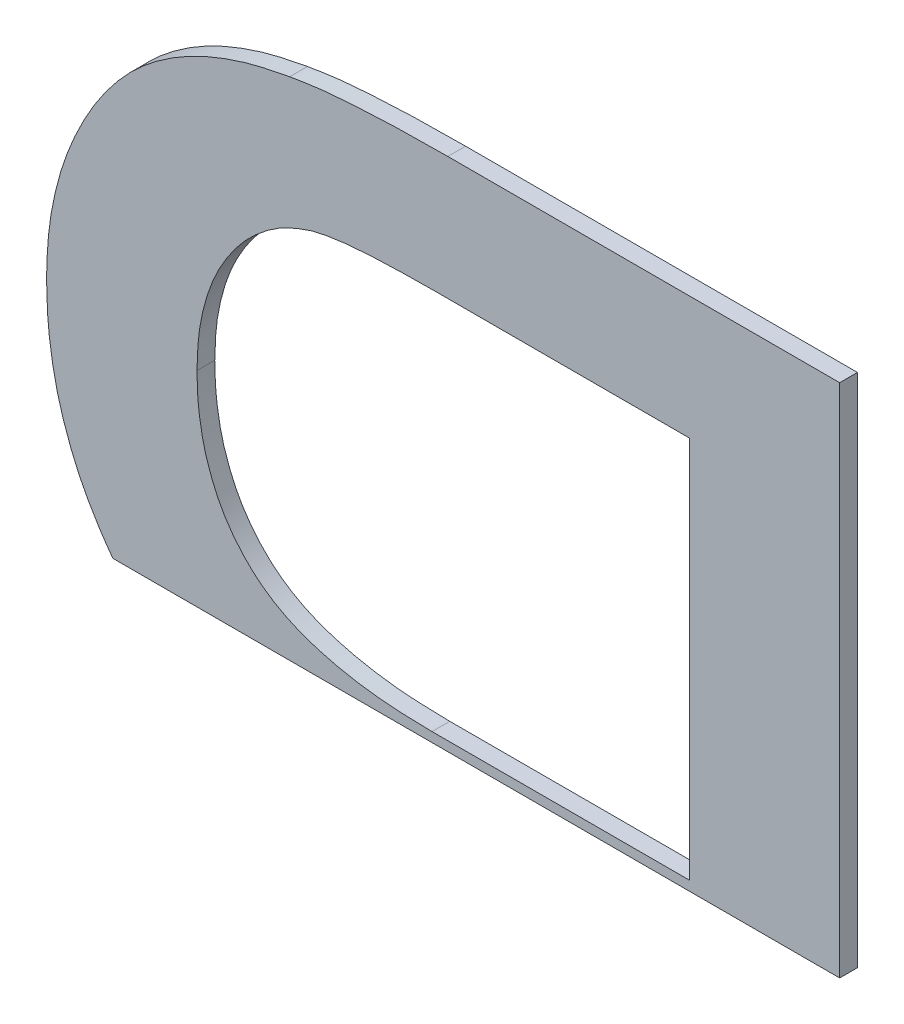
ISO-10303-21;
HEADER;
FILE_DESCRIPTION(('STEP AP214'),'2;1');
FILE_NAME('part.step','',(''),(''),'','','');
FILE_SCHEMA(('AUTOMOTIVE_DESIGN { 1 0 10303 214 1 1 1 1 }'));
ENDSEC;
DATA;
#1=APPLICATION_CONTEXT('core data for automotive mechanical design processes');
#2=APPLICATION_PROTOCOL_DEFINITION('international standard','automotive_design',2000,#1);
#3=PRODUCT_CONTEXT('',#1,'mechanical');
#4=PRODUCT('Part','Part','',(#3));
#5=PRODUCT_RELATED_PRODUCT_CATEGORY('part','',(#4));
#6=PRODUCT_DEFINITION_FORMATION('','',#4);
#7=PRODUCT_DEFINITION_CONTEXT('part definition',#1,'design');
#8=PRODUCT_DEFINITION('design','',#6,#7);
#9=PRODUCT_DEFINITION_SHAPE('','',#8);
#10=(LENGTH_UNIT() NAMED_UNIT(*) SI_UNIT(.MILLI.,.METRE.));
#11=(NAMED_UNIT(*) PLANE_ANGLE_UNIT() SI_UNIT($,.RADIAN.));
#12=(NAMED_UNIT(*) SI_UNIT($,.STERADIAN.) SOLID_ANGLE_UNIT());
#13=UNCERTAINTY_MEASURE_WITH_UNIT(LENGTH_MEASURE(1.E-05),#10,'distance_accuracy_value','');
#14=(GEOMETRIC_REPRESENTATION_CONTEXT(3) GLOBAL_UNCERTAINTY_ASSIGNED_CONTEXT((#13)) GLOBAL_UNIT_ASSIGNED_CONTEXT((#10,
#11,#12)) REPRESENTATION_CONTEXT('',''));
#15=CARTESIAN_POINT('',(0.,0.,0.));
#16=DIRECTION('',(0.,0.,1.));
#17=DIRECTION('',(1.,0.,0.));
#18=AXIS2_PLACEMENT_3D('',#15,#16,#17);
#19=CARTESIAN_POINT('',(10.3846153846154,-15.,0.5));
#20=DIRECTION('',(-1.,0.,0.));
#21=DIRECTION('',(0.,0.,1.));
#22=AXIS2_PLACEMENT_3D('',#19,#20,#21);
#23=PLANE('',#22);
#24=DIRECTION('',(0.,1.,0.));
#25=VECTOR('',#24,1.);
#26=CARTESIAN_POINT('',(10.3846153846154,-15.,0.5));
#27=LINE('',#26,#25);
#28=CARTESIAN_POINT('',(10.3846153846154,0.5,0.5));
#29=VERTEX_POINT('',#28);
#30=CARTESIAN_POINT('',(10.3846153846154,15.,0.5));
#31=VERTEX_POINT('',#30);
#32=EDGE_CURVE('E147',#29,#31,#27,.T.);
#33=ORIENTED_EDGE('',*,*,#32,.F.);
#34=DIRECTION('',(0.,0.,-1.));
#35=VECTOR('',#34,1.);
#36=CARTESIAN_POINT('',(10.3846153846154,0.5,0.5));
#37=LINE('',#36,#35);
#38=CARTESIAN_POINT('',(10.3846153846154,0.5,0.));
#39=VERTEX_POINT('',#38);
#40=EDGE_CURVE('E53',#29,#39,#37,.T.);
#41=ORIENTED_EDGE('',*,*,#40,.T.);
#42=DIRECTION('',(0.,1.,0.));
#43=VECTOR('',#42,1.);
#44=CARTESIAN_POINT('',(10.3846153846154,-15.,0.));
#45=LINE('',#44,#43);
#46=CARTESIAN_POINT('',(10.3846153846154,15.,0.));
#47=VERTEX_POINT('',#46);
#48=EDGE_CURVE('E138',#39,#47,#45,.T.);
#49=ORIENTED_EDGE('',*,*,#48,.T.);
#50=DIRECTION('',(0.,0.,-1.));
#51=VECTOR('',#50,1.);
#52=CARTESIAN_POINT('',(10.3846153846154,15.,0.5));
#53=LINE('',#52,#51);
#54=EDGE_CURVE('E174',#31,#47,#53,.T.);
#55=ORIENTED_EDGE('',*,*,#54,.F.);
#56=EDGE_LOOP('',(#33,#41,#49,#55));
#57=FACE_BOUND('',#56,.T.);
#58=ADVANCED_FACE('F39',(#57),#23,.F.);
#59=CARTESIAN_POINT('',(-11.9230769230769,6.37620192307692,0.5));
#60=CARTESIAN_POINT('',(-11.9164523883656,6.06536319775668,0.5));
#61=CARTESIAN_POINT('',(-11.9034182534223,5.45377097762736,0.5));
#62=CARTESIAN_POINT('',(-11.7914962037805,4.55525374172224,0.5));
#63=CARTESIAN_POINT('',(-11.6149709347498,3.69084362808375,0.5));
#64=CARTESIAN_POINT('',(-11.3516595574946,2.86645592929951,0.5));
#65=CARTESIAN_POINT('',(-11.0297543254307,2.07245274326711,0.5));
#66=CARTESIAN_POINT('',(-10.624079350204,1.32222512292036,0.5));
#67=CARTESIAN_POINT('',(-10.1503654357704,0.605585610203963,0.5));
#68=CARTESIAN_POINT('',(-9.60686856623352,-0.0755157562340138,0.5));
#69=CARTESIAN_POINT('',(-8.96702180481229,-0.707257877884189,0.5));
#70=CARTESIAN_POINT('',(-8.19720749218899,-1.24316686773636,0.5));
#71=CARTESIAN_POINT('',(-7.3122677220458,-1.69317977262245,0.5));
#72=CARTESIAN_POINT('',(-6.31199609916221,-2.05678533275972,0.5));
#73=CARTESIAN_POINT('',(-5.19882080470571,-2.34288431635212,0.5));
#74=CARTESIAN_POINT('',(-3.96909448292088,-2.55250497248433,0.5));
#75=CARTESIAN_POINT('',(-2.62042159325954,-2.66823301951604,0.5));
#76=CARTESIAN_POINT('',(-1.68290914412343,-2.68407729934039,0.5));
#77=CARTESIAN_POINT('',(-1.19591346153845,-2.69230769230769,0.5));
#78=B_SPLINE_CURVE_WITH_KNOTS('',3,(#59,#60,#61,#62,#63,#64,#65,#66,#67,#68,#69,#70,#71,#72,#73,
#74,#75,#76,#77),.UNSPECIFIED.,.F.,.F.,(4,1,1,1,1,1,1,1,1,1,1,1,1,1,1,1,4),(0.,
0.0580480686591468,0.114212755019154,0.168891647175276,0.222626270124239,0.275651229891811,
0.328725027145903,0.381658791237261,0.43595343503421,0.491263855848966,0.548992591180569,
0.610416548658029,0.676247964980973,0.747409474018392,0.824866485744554,0.909025991711439,1.),.UNSPECIFIED.);
#79=DIRECTION('',(0.,0.,-1.));
#80=VECTOR('',#79,1.);
#81=SURFACE_OF_LINEAR_EXTRUSION('',#78,#80);
#82=CARTESIAN_POINT('',(-11.9230769230769,6.37620192307692,0.));
#83=CARTESIAN_POINT('',(-11.9164523883656,6.06536319775668,0.));
#84=CARTESIAN_POINT('',(-11.9034182534223,5.45377097762736,0.));
#85=CARTESIAN_POINT('',(-11.7914962037805,4.55525374172224,0.));
#86=CARTESIAN_POINT('',(-11.6149709347498,3.69084362808375,0.));
#87=CARTESIAN_POINT('',(-11.3516595574946,2.86645592929951,0.));
#88=CARTESIAN_POINT('',(-11.0297543254307,2.07245274326711,0.));
#89=CARTESIAN_POINT('',(-10.624079350204,1.32222512292036,0.));
#90=CARTESIAN_POINT('',(-10.1503654357704,0.605585610203963,0.));
#91=CARTESIAN_POINT('',(-9.60686856623352,-0.0755157562340138,0.));
#92=CARTESIAN_POINT('',(-8.96702180481229,-0.707257877884189,0.));
#93=CARTESIAN_POINT('',(-8.19720749218899,-1.24316686773636,0.));
#94=CARTESIAN_POINT('',(-7.3122677220458,-1.69317977262245,0.));
#95=CARTESIAN_POINT('',(-6.31199609916221,-2.05678533275972,0.));
#96=CARTESIAN_POINT('',(-5.19882080470571,-2.34288431635212,0.));
#97=CARTESIAN_POINT('',(-3.96909448292088,-2.55250497248433,0.));
#98=CARTESIAN_POINT('',(-2.62042159325954,-2.66823301951604,0.));
#99=CARTESIAN_POINT('',(-1.68290914412343,-2.68407729934039,0.));
#100=CARTESIAN_POINT('',(-1.19591346153845,-2.69230769230769,0.));
#101=B_SPLINE_CURVE_WITH_KNOTS('',3,(#82,#83,#84,#85,#86,#87,#88,#89,#90,#91,#92,#93,#94,#95,
#96,#97,#98,#99,#100),.UNSPECIFIED.,.F.,.F.,(4,1,1,1,1,1,1,1,1,1,1,1,1,1,1,1,4),(0.,
0.0580480686591468,0.114212755019154,0.168891647175276,0.222626270124239,0.275651229891811,
0.328725027145903,0.381658791237261,0.43595343503421,0.491263855848966,0.548992591180569,
0.610416548658029,0.676247964980973,0.747409474018392,0.824866485744554,0.909025991711439,1.),.UNSPECIFIED.);
#102=CARTESIAN_POINT('',(-11.9230769230769,6.37620192307692,0.));
#103=VERTEX_POINT('',#102);
#104=CARTESIAN_POINT('',(-10.0563669623201,0.5,0.));
#105=VERTEX_POINT('',#104);
#106=EDGE_CURVE('E127',#103,#105,#101,.T.);
#107=ORIENTED_EDGE('',*,*,#106,.T.);
#108=DIRECTION('',(0.,0.,-1.));
#109=VECTOR('',#108,1.);
#110=CARTESIAN_POINT('',(-10.0563669623201,0.5,0.5));
#111=LINE('',#110,#109);
#112=CARTESIAN_POINT('',(-10.0563669617527,0.5,0.5));
#113=VERTEX_POINT('',#112);
#114=EDGE_CURVE('E123',#105,#113,#111,.F.);
#115=ORIENTED_EDGE('',*,*,#114,.T.);
#116=CARTESIAN_POINT('',(-11.9230769230769,6.37620192307692,0.5));
#117=VERTEX_POINT('',#116);
#118=EDGE_CURVE('E154',#117,#113,#78,.T.);
#119=ORIENTED_EDGE('',*,*,#118,.F.);
#120=DIRECTION('',(0.,0.,-1.));
#121=VECTOR('',#120,1.);
#122=CARTESIAN_POINT('',(-11.9230769230769,6.37620192307692,0.5));
#123=LINE('',#122,#121);
#124=EDGE_CURVE('E129',#117,#103,#123,.T.);
#125=ORIENTED_EDGE('',*,*,#124,.T.);
#126=EDGE_LOOP('',(#107,#115,#119,#125));
#127=FACE_BOUND('',#126,.T.);
#128=ADVANCED_FACE('F139',(#127),#81,.F.);
#129=CARTESIAN_POINT('',(-2.86670923646913,14.9469507429344,0.5));
#130=DIRECTION('',(0.,0.,-1.));
#131=DIRECTION('',(-1.,0.,0.));
#132=AXIS2_PLACEMENT_3D('',#129,#130,#131);
#133=PLANE('',#132);
#134=DIRECTION('',(1.,0.,0.));
#135=VECTOR('',#134,1.);
#136=CARTESIAN_POINT('',(-1.00961538461537,11.5384615384615,0.5));
#137=LINE('',#136,#135);
#138=CARTESIAN_POINT('',(-1.00961538461537,11.5384615384615,0.5));
#139=VERTEX_POINT('',#138);
#140=CARTESIAN_POINT('',(6.15384615384617,11.5384615384615,0.5));
#141=VERTEX_POINT('',#140);
#142=EDGE_CURVE('E188',#139,#141,#137,.T.);
#143=ORIENTED_EDGE('',*,*,#142,.T.);
#144=DIRECTION('',(0.,-1.,0.));
#145=VECTOR('',#144,1.);
#146=CARTESIAN_POINT('',(6.15384615384617,11.5384615384615,0.5));
#147=LINE('',#146,#145);
#148=CARTESIAN_POINT('',(6.15384615384617,0.769230769230767,0.5));
#149=VERTEX_POINT('',#148);
#150=EDGE_CURVE('E195',#141,#149,#147,.T.);
#151=ORIENTED_EDGE('',*,*,#150,.T.);
#152=DIRECTION('',(-1.,0.,0.));
#153=VECTOR('',#152,1.);
#154=CARTESIAN_POINT('',(6.15384615384617,0.769230769230767,0.5));
#155=LINE('',#154,#153);
#156=CARTESIAN_POINT('',(-1.08173076923075,0.769230769230767,0.5));
#157=VERTEX_POINT('',#156);
#158=EDGE_CURVE('E255',#149,#157,#155,.T.);
#159=ORIENTED_EDGE('',*,*,#158,.T.);
#160=CARTESIAN_POINT('',(-1.08173076923075,0.769230769230767,0.5));
#161=CARTESIAN_POINT('',(-1.37031400962702,0.774055990655361,0.5));
#162=CARTESIAN_POINT('',(-1.92624287782716,0.783351332552924,0.5));
#163=CARTESIAN_POINT('',(-2.72953473754154,0.848219277515443,0.5));
#164=CARTESIAN_POINT('',(-3.46675844790728,0.960502700280922,0.5));
#165=CARTESIAN_POINT('',(-4.1399590019052,1.11710520157451,0.5));
#166=CARTESIAN_POINT('',(-4.74999360264593,1.31175761566908,0.5));
#167=CARTESIAN_POINT('',(-5.29577077219165,1.55793934225839,0.5));
#168=CARTESIAN_POINT('',(-5.77447610888803,1.85324831203823,0.5));
#169=CARTESIAN_POINT('',(-6.18928163394163,2.19467530029792,0.5));
#170=CARTESIAN_POINT('',(-6.54534536535054,2.57715682541306,0.5));
#171=CARTESIAN_POINT('',(-6.85386612407712,2.99442305852459,0.5));
#172=CARTESIAN_POINT('',(-7.11600203735596,3.44945584013187,0.5));
#173=CARTESIAN_POINT('',(-7.32148561626384,3.94415898642623,0.5));
#174=CARTESIAN_POINT('',(-7.4955585376525,4.46890955858489,0.5));
#175=CARTESIAN_POINT('',(-7.60421146642071,5.03458042255102,0.5));
#176=CARTESIAN_POINT('',(-7.67975750639046,5.63296852000707,0.5));
#177=CARTESIAN_POINT('',(-7.68806564119163,6.04541734277417,0.5));
#178=CARTESIAN_POINT('',(-7.69230769230768,6.25600961538461,0.5));
#179=B_SPLINE_CURVE_WITH_KNOTS('',3,(#160,#161,#162,#163,#164,#165,#166,#167,#168,#169,#170,
#171,#172,#173,#174,#175,#176,#177,#178),.UNSPECIFIED.,.F.,.F.,(4,1,1,1,1,1,1,1,1,1,1,1,1,1,1,1,
4),(0.,0.0877310226443747,0.169005684660541,0.244802144396213,0.314231761771564,
0.378941580520446,0.439171854935432,0.49578670264117,0.549434768970673,0.602000335423469,
0.654254525291273,0.706904693032372,0.761202146387593,0.816862306733052,0.874669995750775,
0.936007744563197,1.),.UNSPECIFIED.);
#180=CARTESIAN_POINT('',(-7.69230769230768,6.25600961538461,0.5));
#181=VERTEX_POINT('',#180);
#182=EDGE_CURVE('E247',#157,#181,#179,.T.);
#183=ORIENTED_EDGE('',*,*,#182,.T.);
#184=CARTESIAN_POINT('',(-7.69230769230768,6.25600961538461,0.5));
#185=CARTESIAN_POINT('',(-7.68334578057861,6.56140199861163,0.5));
#186=CARTESIAN_POINT('',(-7.66598072463034,7.15314581189967,0.5));
#187=CARTESIAN_POINT('',(-7.49102346242659,8.00464693690172,0.5));
#188=CARTESIAN_POINT('',(-7.21672743718203,8.79144907391843,0.5));
#189=CARTESIAN_POINT('',(-6.82401624933714,9.49865557974401,0.5));
#190=CARTESIAN_POINT('',(-6.34872148278842,10.1190640458932,0.5));
#191=CARTESIAN_POINT('',(-5.79002255792669,10.6266602933011,0.5));
#192=CARTESIAN_POINT('',(-5.16583151627625,11.0324647862556,0.5));
#193=CARTESIAN_POINT('',(-4.69978079816894,11.1931435757386,0.5));
#194=CARTESIAN_POINT('',(-4.46514423076921,11.2740384615385,0.5));
#195=B_SPLINE_CURVE_WITH_KNOTS('',3,(#184,#185,#186,#187,#188,#189,#190,#191,#192,#193,#194),
.UNSPECIFIED.,.F.,.F.,(4,1,1,1,1,1,1,1,4),(0.,0.14289460138112,0.27687984692363,
0.405406725510109,0.531833372930009,0.654224986869887,0.769810940790896,0.884109671743148,1.),.UNSPECIFIED.);
#196=CARTESIAN_POINT('',(-4.46514423076921,11.2740384615385,0.5));
#197=VERTEX_POINT('',#196);
#198=EDGE_CURVE('E254',#181,#197,#195,.T.);
#199=ORIENTED_EDGE('',*,*,#198,.T.);
#200=CARTESIAN_POINT('',(-4.46514423076921,11.2740384615385,0.5));
#201=CARTESIAN_POINT('',(-4.3792128004865,11.295050594988,0.5));
#202=CARTESIAN_POINT('',(-4.19247789431203,11.3407114056522,0.5));
#203=CARTESIAN_POINT('',(-3.88315298428619,11.3925371140144,0.5));
#204=CARTESIAN_POINT('',(-3.5246617109382,11.441611456393,0.5));
#205=CARTESIAN_POINT('',(-3.11525660846265,11.4741699984362,0.5));
#206=CARTESIAN_POINT('',(-2.6586713489867,11.5065047734513,0.5));
#207=CARTESIAN_POINT('',(-2.15351009433788,11.5214102993299,0.5));
#208=CARTESIAN_POINT('',(-1.59862210032687,11.53428442385,0.5));
#209=CARTESIAN_POINT('',(-1.21194937368708,11.5370266273822,0.5));
#210=CARTESIAN_POINT('',(-1.00961538461537,11.5384615384615,0.5));
#211=B_SPLINE_CURVE_WITH_KNOTS('',3,(#200,#201,#202,#203,#204,#205,#206,#207,#208,#209,#210),
.UNSPECIFIED.,.F.,.F.,(4,1,1,1,1,1,1,1,4),(0.,0.0763829976036969,0.165985505465532,
0.270714880261737,0.388824082683411,0.520601870042667,0.666029478257653,0.825243459802021,1.),.UNSPECIFIED.);
#212=EDGE_CURVE('E160',#197,#139,#211,.T.);
#213=ORIENTED_EDGE('',*,*,#212,.T.);
#214=EDGE_LOOP('',(#143,#151,#159,#183,#199,#213));
#215=FACE_BOUND('',#214,.T.);
#216=ORIENTED_EDGE('',*,*,#118,.T.);
#217=DIRECTION('',(1.,0.,0.));
#218=VECTOR('',#217,1.);
#219=CARTESIAN_POINT('',(-2.86670923646913,0.5,0.5));
#220=LINE('',#219,#218);
#221=EDGE_CURVE('E125',#113,#29,#220,.T.);
#222=ORIENTED_EDGE('',*,*,#221,.T.);
#223=ORIENTED_EDGE('',*,*,#32,.T.);
#224=DIRECTION('',(-1.,0.,0.));
#225=VECTOR('',#224,1.);
#226=CARTESIAN_POINT('',(10.3846153846154,15.,0.5));
#227=LINE('',#226,#225);
#228=CARTESIAN_POINT('',(-0.637019230769215,15.,0.5));
#229=VERTEX_POINT('',#228);
#230=EDGE_CURVE('E152',#31,#229,#227,.T.);
#231=ORIENTED_EDGE('',*,*,#230,.T.);
#232=CARTESIAN_POINT('',(-0.637019230769215,15.,0.5));
#233=CARTESIAN_POINT('',(-1.09385710208085,14.9973973572728,0.5));
#234=CARTESIAN_POINT('',(-1.9518007669298,14.9925095820249,0.5));
#235=CARTESIAN_POINT('',(-3.14990807210546,14.9352674491746,0.5));
#236=CARTESIAN_POINT('',(-4.1787422728565,14.8644494557816,0.5));
#237=CARTESIAN_POINT('',(-4.80016226334036,14.7636230525038,0.5));
#238=CARTESIAN_POINT('',(-5.0841346153846,14.7175480769231,0.5));
#239=B_SPLINE_CURVE_WITH_KNOTS('',3,(#232,#233,#234,#235,#236,#237,#238),.UNSPECIFIED.,.F.,.F.,
(4,1,1,1,4),(0.,0.30716263010994,0.576852859909682,0.80663304935093,1.),.UNSPECIFIED.);
#240=CARTESIAN_POINT('',(-5.0841346153846,14.7175480769231,0.5));
#241=VERTEX_POINT('',#240);
#242=EDGE_CURVE('E181',#229,#241,#239,.T.);
#243=ORIENTED_EDGE('',*,*,#242,.T.);
#244=CARTESIAN_POINT('',(-5.0841346153846,14.7175480769231,0.5));
#245=CARTESIAN_POINT('',(-5.43051233286228,14.6508869108881,0.5));
#246=CARTESIAN_POINT('',(-6.10188890126317,14.5216789894778,0.5));
#247=CARTESIAN_POINT('',(-7.05245406077552,14.210186718726,0.5));
#248=CARTESIAN_POINT('',(-7.91847398669778,13.8225583661339,0.5));
#249=CARTESIAN_POINT('',(-8.69859525557513,13.3396134368398,0.5));
#250=CARTESIAN_POINT('',(-9.40577809225333,12.7722712739663,0.5));
#251=CARTESIAN_POINT('',(-10.0299443343736,12.0924621825944,0.5));
#252=CARTESIAN_POINT('',(-10.5832205987864,11.3153651021496,0.5));
#253=CARTESIAN_POINT('',(-11.0536744308567,10.4415880655059,0.5));
#254=CARTESIAN_POINT('',(-11.445255162537,9.50140434881333,0.5));
#255=CARTESIAN_POINT('',(-11.7195198341879,8.49978337006842,0.5));
#256=CARTESIAN_POINT('',(-11.8951868503596,7.45412693028206,0.5));
#257=CARTESIAN_POINT('',(-11.9136769711717,6.73950119905491,0.5));
#258=CARTESIAN_POINT('',(-11.9230769230769,6.37620192307692,0.5));
#259=B_SPLINE_CURVE_WITH_KNOTS('',3,(#244,#245,#246,#247,#248,#249,#250,#251,#252,#253,#254,
#255,#256,#257,#258),.UNSPECIFIED.,.F.,.F.,(4,1,1,1,1,1,1,1,1,1,1,1,4),(0.,0.0892424937815286,
0.172976829072268,0.252655137236809,0.328953394400984,0.404688082466292,0.481498893566958,
0.561870090596224,0.645629004836724,0.73229124918868,0.819178844814805,0.908074685965368,1.),.UNSPECIFIED.);
#260=EDGE_CURVE('E177',#241,#117,#259,.T.);
#261=ORIENTED_EDGE('',*,*,#260,.T.);
#262=EDGE_LOOP('',(#216,#222,#223,#231,#243,#261));
#263=FACE_BOUND('',#262,.T.);
#264=ADVANCED_FACE('F161',(#215,#263),#133,.F.);
#265=CARTESIAN_POINT('',(10.3846153846154,15.,0.5));
#266=DIRECTION('',(0.,-1.,0.));
#267=DIRECTION('',(0.,0.,-1.));
#268=AXIS2_PLACEMENT_3D('',#265,#266,#267);
#269=PLANE('',#268);
#270=DIRECTION('',(-1.,0.,0.));
#271=VECTOR('',#270,1.);
#272=CARTESIAN_POINT('',(10.3846153846154,15.,0.));
#273=LINE('',#272,#271);
#274=CARTESIAN_POINT('',(-0.637019230769215,15.,0.));
#275=VERTEX_POINT('',#274);
#276=EDGE_CURVE('E184',#47,#275,#273,.T.);
#277=ORIENTED_EDGE('',*,*,#276,.T.);
#278=DIRECTION('',(0.,0.,-1.));
#279=VECTOR('',#278,1.);
#280=CARTESIAN_POINT('',(-0.637019230769215,15.,0.5));
#281=LINE('',#280,#279);
#282=EDGE_CURVE('E202',#229,#275,#281,.T.);
#283=ORIENTED_EDGE('',*,*,#282,.F.);
#284=ORIENTED_EDGE('',*,*,#230,.F.);
#285=ORIENTED_EDGE('',*,*,#54,.T.);
#286=EDGE_LOOP('',(#277,#283,#284,#285));
#287=FACE_BOUND('',#286,.T.);
#288=ADVANCED_FACE('F444',(#287),#269,.F.);
#289=DIRECTION('',(0.,0.,-1.));
#290=VECTOR('',#289,1.);
#291=SURFACE_OF_LINEAR_EXTRUSION('',#239,#290);
#292=CARTESIAN_POINT('',(-0.637019230769215,15.,0.));
#293=CARTESIAN_POINT('',(-1.09385710208085,14.9973973572728,0.));
#294=CARTESIAN_POINT('',(-1.9518007669298,14.9925095820249,0.));
#295=CARTESIAN_POINT('',(-3.14990807210546,14.9352674491746,0.));
#296=CARTESIAN_POINT('',(-4.1787422728565,14.8644494557816,0.));
#297=CARTESIAN_POINT('',(-4.80016226334036,14.7636230525038,0.));
#298=CARTESIAN_POINT('',(-5.0841346153846,14.7175480769231,0.));
#299=B_SPLINE_CURVE_WITH_KNOTS('',3,(#292,#293,#294,#295,#296,#297,#298),.UNSPECIFIED.,.F.,.F.,
(4,1,1,1,4),(0.,0.30716263010994,0.576852859909682,0.80663304935093,1.),.UNSPECIFIED.);
#300=CARTESIAN_POINT('',(-5.0841346153846,14.7175480769231,0.));
#301=VERTEX_POINT('',#300);
#302=EDGE_CURVE('E205',#275,#301,#299,.T.);
#303=ORIENTED_EDGE('',*,*,#302,.T.);
#304=DIRECTION('',(0.,0.,-1.));
#305=VECTOR('',#304,1.);
#306=CARTESIAN_POINT('',(-5.0841346153846,14.7175480769231,0.5));
#307=LINE('',#306,#305);
#308=EDGE_CURVE('E197',#241,#301,#307,.T.);
#309=ORIENTED_EDGE('',*,*,#308,.F.);
#310=ORIENTED_EDGE('',*,*,#242,.F.);
#311=ORIENTED_EDGE('',*,*,#282,.T.);
#312=EDGE_LOOP('',(#303,#309,#310,#311));
#313=FACE_BOUND('',#312,.T.);
#314=ADVANCED_FACE('F230',(#313),#291,.F.);
#315=DIRECTION('',(0.,0.,-1.));
#316=VECTOR('',#315,1.);
#317=SURFACE_OF_LINEAR_EXTRUSION('',#259,#316);
#318=CARTESIAN_POINT('',(-5.0841346153846,14.7175480769231,0.));
#319=CARTESIAN_POINT('',(-5.43051233286228,14.6508869108881,0.));
#320=CARTESIAN_POINT('',(-6.10188890126317,14.5216789894778,0.));
#321=CARTESIAN_POINT('',(-7.05245406077552,14.210186718726,0.));
#322=CARTESIAN_POINT('',(-7.91847398669778,13.8225583661339,0.));
#323=CARTESIAN_POINT('',(-8.69859525557513,13.3396134368398,0.));
#324=CARTESIAN_POINT('',(-9.40577809225333,12.7722712739663,0.));
#325=CARTESIAN_POINT('',(-10.0299443343736,12.0924621825944,0.));
#326=CARTESIAN_POINT('',(-10.5832205987864,11.3153651021496,0.));
#327=CARTESIAN_POINT('',(-11.0536744308567,10.4415880655059,0.));
#328=CARTESIAN_POINT('',(-11.445255162537,9.50140434881333,0.));
#329=CARTESIAN_POINT('',(-11.7195198341879,8.49978337006842,0.));
#330=CARTESIAN_POINT('',(-11.8951868503596,7.45412693028206,0.));
#331=CARTESIAN_POINT('',(-11.9136769711717,6.73950119905491,0.));
#332=CARTESIAN_POINT('',(-11.9230769230769,6.37620192307692,0.));
#333=B_SPLINE_CURVE_WITH_KNOTS('',3,(#318,#319,#320,#321,#322,#323,#324,#325,#326,#327,#328,
#329,#330,#331,#332),.UNSPECIFIED.,.F.,.F.,(4,1,1,1,1,1,1,1,1,1,1,1,4),(0.,0.0892424937815286,
0.172976829072268,0.252655137236809,0.328953394400984,0.404688082466292,0.481498893566958,
0.561870090596224,0.645629004836724,0.73229124918868,0.819178844814805,0.908074685965368,1.),.UNSPECIFIED.);
#334=EDGE_CURVE('E187',#301,#103,#333,.T.);
#335=ORIENTED_EDGE('',*,*,#334,.T.);
#336=ORIENTED_EDGE('',*,*,#124,.F.);
#337=ORIENTED_EDGE('',*,*,#260,.F.);
#338=ORIENTED_EDGE('',*,*,#308,.T.);
#339=EDGE_LOOP('',(#335,#336,#337,#338));
#340=FACE_BOUND('',#339,.T.);
#341=ADVANCED_FACE('F190',(#340),#317,.F.);
#342=CARTESIAN_POINT('',(-2.86670923646913,14.9469507429344,0.));
#343=DIRECTION('',(0.,0.,-1.));
#344=DIRECTION('',(-1.,0.,0.));
#345=AXIS2_PLACEMENT_3D('',#342,#343,#344);
#346=PLANE('',#345);
#347=DIRECTION('',(1.,0.,0.));
#348=VECTOR('',#347,1.);
#349=CARTESIAN_POINT('',(-2.86670923646913,0.5,0.));
#350=LINE('',#349,#348);
#351=EDGE_CURVE('E11',#105,#39,#350,.T.);
#352=ORIENTED_EDGE('',*,*,#351,.F.);
#353=ORIENTED_EDGE('',*,*,#106,.F.);
#354=ORIENTED_EDGE('',*,*,#334,.F.);
#355=ORIENTED_EDGE('',*,*,#302,.F.);
#356=ORIENTED_EDGE('',*,*,#276,.F.);
#357=ORIENTED_EDGE('',*,*,#48,.F.);
#358=EDGE_LOOP('',(#352,#353,#354,#355,#356,#357));
#359=FACE_BOUND('',#358,.T.);
#360=DIRECTION('',(0.,-1.,0.));
#361=VECTOR('',#360,1.);
#362=CARTESIAN_POINT('',(6.15384615384617,11.5384615384615,0.));
#363=LINE('',#362,#361);
#364=CARTESIAN_POINT('',(6.15384615384617,11.5384615384615,0.));
#365=VERTEX_POINT('',#364);
#366=CARTESIAN_POINT('',(6.15384615384617,0.769230769230767,0.));
#367=VERTEX_POINT('',#366);
#368=EDGE_CURVE('E272',#365,#367,#363,.T.);
#369=ORIENTED_EDGE('',*,*,#368,.F.);
#370=DIRECTION('',(1.,0.,0.));
#371=VECTOR('',#370,1.);
#372=CARTESIAN_POINT('',(-1.00961538461537,11.5384615384615,0.));
#373=LINE('',#372,#371);
#374=CARTESIAN_POINT('',(-1.00961538461537,11.5384615384615,0.));
#375=VERTEX_POINT('',#374);
#376=EDGE_CURVE('E297',#375,#365,#373,.T.);
#377=ORIENTED_EDGE('',*,*,#376,.F.);
#378=CARTESIAN_POINT('',(-4.46514423076921,11.2740384615385,0.));
#379=CARTESIAN_POINT('',(-4.3792128004865,11.295050594988,0.));
#380=CARTESIAN_POINT('',(-4.19247789431203,11.3407114056522,0.));
#381=CARTESIAN_POINT('',(-3.88315298428619,11.3925371140144,0.));
#382=CARTESIAN_POINT('',(-3.5246617109382,11.441611456393,0.));
#383=CARTESIAN_POINT('',(-3.11525660846265,11.4741699984362,0.));
#384=CARTESIAN_POINT('',(-2.6586713489867,11.5065047734513,0.));
#385=CARTESIAN_POINT('',(-2.15351009433788,11.5214102993299,0.));
#386=CARTESIAN_POINT('',(-1.59862210032687,11.53428442385,0.));
#387=CARTESIAN_POINT('',(-1.21194937368708,11.5370266273822,0.));
#388=CARTESIAN_POINT('',(-1.00961538461537,11.5384615384615,0.));
#389=B_SPLINE_CURVE_WITH_KNOTS('',3,(#378,#379,#380,#381,#382,#383,#384,#385,#386,#387,#388),
.UNSPECIFIED.,.F.,.F.,(4,1,1,1,1,1,1,1,4),(0.,0.0763829976036969,0.165985505465532,
0.270714880261737,0.388824082683411,0.520601870042667,0.666029478257653,0.825243459802021,1.),.UNSPECIFIED.);
#390=CARTESIAN_POINT('',(-4.46514423076921,11.2740384615385,0.));
#391=VERTEX_POINT('',#390);
#392=EDGE_CURVE('E291',#391,#375,#389,.T.);
#393=ORIENTED_EDGE('',*,*,#392,.F.);
#394=CARTESIAN_POINT('',(-7.69230769230768,6.25600961538461,0.));
#395=CARTESIAN_POINT('',(-7.68334578057861,6.56140199861163,0.));
#396=CARTESIAN_POINT('',(-7.66598072463034,7.15314581189967,0.));
#397=CARTESIAN_POINT('',(-7.49102346242659,8.00464693690172,0.));
#398=CARTESIAN_POINT('',(-7.21672743718203,8.79144907391843,0.));
#399=CARTESIAN_POINT('',(-6.82401624933714,9.49865557974401,0.));
#400=CARTESIAN_POINT('',(-6.34872148278842,10.1190640458932,0.));
#401=CARTESIAN_POINT('',(-5.79002255792669,10.6266602933011,0.));
#402=CARTESIAN_POINT('',(-5.16583151627625,11.0324647862556,0.));
#403=CARTESIAN_POINT('',(-4.69978079816894,11.1931435757386,0.));
#404=CARTESIAN_POINT('',(-4.46514423076921,11.2740384615385,0.));
#405=B_SPLINE_CURVE_WITH_KNOTS('',3,(#394,#395,#396,#397,#398,#399,#400,#401,#402,#403,#404),
.UNSPECIFIED.,.F.,.F.,(4,1,1,1,1,1,1,1,4),(0.,0.14289460138112,0.27687984692363,
0.405406725510109,0.531833372930009,0.654224986869887,0.769810940790896,0.884109671743148,1.),.UNSPECIFIED.);
#406=CARTESIAN_POINT('',(-7.69230769230768,6.25600961538461,0.));
#407=VERTEX_POINT('',#406);
#408=EDGE_CURVE('E288',#407,#391,#405,.T.);
#409=ORIENTED_EDGE('',*,*,#408,.F.);
#410=CARTESIAN_POINT('',(-1.08173076923075,0.769230769230767,0.));
#411=CARTESIAN_POINT('',(-1.37031400962702,0.774055990655361,0.));
#412=CARTESIAN_POINT('',(-1.92624287782716,0.783351332552924,0.));
#413=CARTESIAN_POINT('',(-2.72953473754154,0.848219277515443,0.));
#414=CARTESIAN_POINT('',(-3.46675844790728,0.960502700280922,0.));
#415=CARTESIAN_POINT('',(-4.1399590019052,1.11710520157451,0.));
#416=CARTESIAN_POINT('',(-4.74999360264593,1.31175761566908,0.));
#417=CARTESIAN_POINT('',(-5.29577077219165,1.55793934225839,0.));
#418=CARTESIAN_POINT('',(-5.77447610888803,1.85324831203823,0.));
#419=CARTESIAN_POINT('',(-6.18928163394163,2.19467530029792,0.));
#420=CARTESIAN_POINT('',(-6.54534536535054,2.57715682541306,0.));
#421=CARTESIAN_POINT('',(-6.85386612407712,2.99442305852459,0.));
#422=CARTESIAN_POINT('',(-7.11600203735596,3.44945584013187,0.));
#423=CARTESIAN_POINT('',(-7.32148561626384,3.94415898642623,0.));
#424=CARTESIAN_POINT('',(-7.4955585376525,4.46890955858489,0.));
#425=CARTESIAN_POINT('',(-7.60421146642071,5.03458042255102,0.));
#426=CARTESIAN_POINT('',(-7.67975750639046,5.63296852000707,0.));
#427=CARTESIAN_POINT('',(-7.68806564119163,6.04541734277417,0.));
#428=CARTESIAN_POINT('',(-7.69230769230768,6.25600961538461,0.));
#429=B_SPLINE_CURVE_WITH_KNOTS('',3,(#410,#411,#412,#413,#414,#415,#416,#417,#418,#419,#420,
#421,#422,#423,#424,#425,#426,#427,#428),.UNSPECIFIED.,.F.,.F.,(4,1,1,1,1,1,1,1,1,1,1,1,1,1,1,1,
4),(0.,0.0877310226443747,0.169005684660541,0.244802144396213,0.314231761771564,
0.378941580520446,0.439171854935432,0.49578670264117,0.549434768970673,0.602000335423469,
0.654254525291273,0.706904693032372,0.761202146387593,0.816862306733052,0.874669995750775,
0.936007744563197,1.),.UNSPECIFIED.);
#430=CARTESIAN_POINT('',(-1.08173076923075,0.769230769230767,0.));
#431=VERTEX_POINT('',#430);
#432=EDGE_CURVE('E284',#431,#407,#429,.T.);
#433=ORIENTED_EDGE('',*,*,#432,.F.);
#434=DIRECTION('',(-1.,0.,0.));
#435=VECTOR('',#434,1.);
#436=CARTESIAN_POINT('',(6.15384615384617,0.769230769230767,0.));
#437=LINE('',#436,#435);
#438=EDGE_CURVE('E280',#367,#431,#437,.T.);
#439=ORIENTED_EDGE('',*,*,#438,.F.);
#440=EDGE_LOOP('',(#369,#377,#393,#409,#433,#439));
#441=FACE_BOUND('',#440,.T.);
#442=ADVANCED_FACE('F41',(#359,#441),#346,.T.);
#443=CARTESIAN_POINT('',(6.15384615384617,11.5384615384615,0.5));
#444=DIRECTION('',(1.,0.,0.));
#445=DIRECTION('',(0.,0.,-1.));
#446=AXIS2_PLACEMENT_3D('',#443,#444,#445);
#447=PLANE('',#446);
#448=ORIENTED_EDGE('',*,*,#368,.T.);
#449=DIRECTION('',(0.,0.,-1.));
#450=VECTOR('',#449,1.);
#451=CARTESIAN_POINT('',(6.15384615384617,0.769230769230767,0.5));
#452=LINE('',#451,#450);
#453=EDGE_CURVE('E48',#149,#367,#452,.T.);
#454=ORIENTED_EDGE('',*,*,#453,.F.);
#455=ORIENTED_EDGE('',*,*,#150,.F.);
#456=DIRECTION('',(0.,0.,-1.));
#457=VECTOR('',#456,1.);
#458=CARTESIAN_POINT('',(6.15384615384617,11.5384615384615,0.5));
#459=LINE('',#458,#457);
#460=EDGE_CURVE('E269',#141,#365,#459,.T.);
#461=ORIENTED_EDGE('',*,*,#460,.T.);
#462=EDGE_LOOP('',(#448,#454,#455,#461));
#463=FACE_BOUND('',#462,.T.);
#464=ADVANCED_FACE('F227',(#463),#447,.F.);
#465=CARTESIAN_POINT('',(-1.00961538461537,11.5384615384615,0.5));
#466=DIRECTION('',(0.,1.,0.));
#467=DIRECTION('',(0.,0.,1.));
#468=AXIS2_PLACEMENT_3D('',#465,#466,#467);
#469=PLANE('',#468);
#470=ORIENTED_EDGE('',*,*,#376,.T.);
#471=ORIENTED_EDGE('',*,*,#460,.F.);
#472=ORIENTED_EDGE('',*,*,#142,.F.);
#473=DIRECTION('',(0.,0.,-1.));
#474=VECTOR('',#473,1.);
#475=CARTESIAN_POINT('',(-1.00961538461537,11.5384615384615,0.5));
#476=LINE('',#475,#474);
#477=EDGE_CURVE('E294',#139,#375,#476,.T.);
#478=ORIENTED_EDGE('',*,*,#477,.T.);
#479=EDGE_LOOP('',(#470,#471,#472,#478));
#480=FACE_BOUND('',#479,.T.);
#481=ADVANCED_FACE('F235',(#480),#469,.F.);
#482=DIRECTION('',(0.,0.,-1.));
#483=VECTOR('',#482,1.);
#484=SURFACE_OF_LINEAR_EXTRUSION('',#211,#483);
#485=ORIENTED_EDGE('',*,*,#392,.T.);
#486=ORIENTED_EDGE('',*,*,#477,.F.);
#487=ORIENTED_EDGE('',*,*,#212,.F.);
#488=DIRECTION('',(0.,0.,-1.));
#489=VECTOR('',#488,1.);
#490=CARTESIAN_POINT('',(-4.46514423076921,11.2740384615385,0.5));
#491=LINE('',#490,#489);
#492=EDGE_CURVE('E292',#197,#391,#491,.T.);
#493=ORIENTED_EDGE('',*,*,#492,.T.);
#494=EDGE_LOOP('',(#485,#486,#487,#493));
#495=FACE_BOUND('',#494,.T.);
#496=ADVANCED_FACE('F323',(#495),#484,.F.);
#497=DIRECTION('',(0.,0.,-1.));
#498=VECTOR('',#497,1.);
#499=SURFACE_OF_LINEAR_EXTRUSION('',#195,#498);
#500=ORIENTED_EDGE('',*,*,#408,.T.);
#501=ORIENTED_EDGE('',*,*,#492,.F.);
#502=ORIENTED_EDGE('',*,*,#198,.F.);
#503=DIRECTION('',(0.,0.,-1.));
#504=VECTOR('',#503,1.);
#505=CARTESIAN_POINT('',(-7.69230769230768,6.25600961538461,0.5));
#506=LINE('',#505,#504);
#507=EDGE_CURVE('E287',#181,#407,#506,.T.);
#508=ORIENTED_EDGE('',*,*,#507,.T.);
#509=EDGE_LOOP('',(#500,#501,#502,#508));
#510=FACE_BOUND('',#509,.T.);
#511=ADVANCED_FACE('F244',(#510),#499,.F.);
#512=DIRECTION('',(0.,0.,-1.));
#513=VECTOR('',#512,1.);
#514=SURFACE_OF_LINEAR_EXTRUSION('',#179,#513);
#515=ORIENTED_EDGE('',*,*,#432,.T.);
#516=ORIENTED_EDGE('',*,*,#507,.F.);
#517=ORIENTED_EDGE('',*,*,#182,.F.);
#518=DIRECTION('',(0.,0.,-1.));
#519=VECTOR('',#518,1.);
#520=CARTESIAN_POINT('',(-1.08173076923075,0.769230769230767,0.5));
#521=LINE('',#520,#519);
#522=EDGE_CURVE('E279',#157,#431,#521,.T.);
#523=ORIENTED_EDGE('',*,*,#522,.T.);
#524=EDGE_LOOP('',(#515,#516,#517,#523));
#525=FACE_BOUND('',#524,.T.);
#526=ADVANCED_FACE('F240',(#525),#514,.F.);
#527=CARTESIAN_POINT('',(6.15384615384617,0.769230769230767,0.5));
#528=DIRECTION('',(0.,-1.,0.));
#529=DIRECTION('',(0.,0.,-1.));
#530=AXIS2_PLACEMENT_3D('',#527,#528,#529);
#531=PLANE('',#530);
#532=ORIENTED_EDGE('',*,*,#438,.T.);
#533=ORIENTED_EDGE('',*,*,#522,.F.);
#534=ORIENTED_EDGE('',*,*,#158,.F.);
#535=ORIENTED_EDGE('',*,*,#453,.T.);
#536=EDGE_LOOP('',(#532,#533,#534,#535));
#537=FACE_BOUND('',#536,.T.);
#538=ADVANCED_FACE('F233',(#537),#531,.F.);
#539=CARTESIAN_POINT('',(-17.,0.5,1.));
#540=DIRECTION('',(0.,1.,0.));
#541=DIRECTION('',(0.,0.,1.));
#542=AXIS2_PLACEMENT_3D('',#539,#540,#541);
#543=PLANE('',#542);
#544=ORIENTED_EDGE('',*,*,#221,.F.);
#545=ORIENTED_EDGE('',*,*,#114,.F.);
#546=ORIENTED_EDGE('',*,*,#351,.T.);
#547=ORIENTED_EDGE('',*,*,#40,.F.);
#548=EDGE_LOOP('',(#544,#545,#546,#547));
#549=FACE_BOUND('',#548,.T.);
#550=ADVANCED_FACE('F121',(#549),#543,.F.);
#551=CLOSED_SHELL('',(#58,#128,#264,#288,#314,#341,#442,#464,#481,#496,#511,#526,#538,#550));
#552=MANIFOLD_SOLID_BREP('B2',#551);
#553=ADVANCED_BREP_SHAPE_REPRESENTATION('',(#18,#552),#14);
#554=SHAPE_DEFINITION_REPRESENTATION(#9,#553);
ENDSEC;
END-ISO-10303-21;
